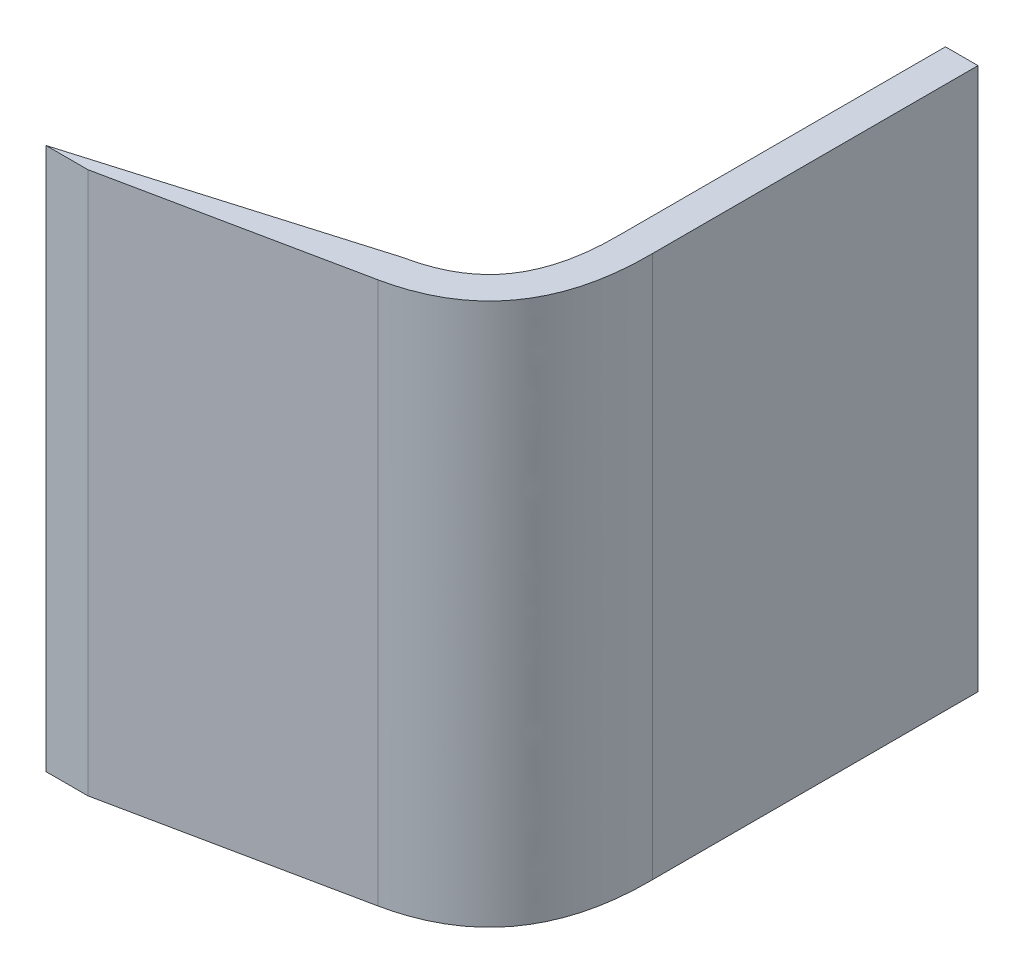
ISO-10303-21;
HEADER;
FILE_DESCRIPTION(('STEP AP214'),'2;1');
FILE_NAME('part.step','',(''),(''),'','','');
FILE_SCHEMA(('AUTOMOTIVE_DESIGN { 1 0 10303 214 1 1 1 1 }'));
ENDSEC;
DATA;
#1=APPLICATION_CONTEXT('core data for automotive mechanical design processes');
#2=APPLICATION_PROTOCOL_DEFINITION('international standard','automotive_design',2000,#1);
#3=PRODUCT_CONTEXT('',#1,'mechanical');
#4=PRODUCT('Part','Part','',(#3));
#5=PRODUCT_RELATED_PRODUCT_CATEGORY('part','',(#4));
#6=PRODUCT_DEFINITION_FORMATION('','',#4);
#7=PRODUCT_DEFINITION_CONTEXT('part definition',#1,'design');
#8=PRODUCT_DEFINITION('design','',#6,#7);
#9=PRODUCT_DEFINITION_SHAPE('','',#8);
#10=(LENGTH_UNIT() NAMED_UNIT(*) SI_UNIT(.MILLI.,.METRE.));
#11=(NAMED_UNIT(*) PLANE_ANGLE_UNIT() SI_UNIT($,.RADIAN.));
#12=(NAMED_UNIT(*) SI_UNIT($,.STERADIAN.) SOLID_ANGLE_UNIT());
#13=UNCERTAINTY_MEASURE_WITH_UNIT(LENGTH_MEASURE(1.E-05),#10,'distance_accuracy_value','');
#14=(GEOMETRIC_REPRESENTATION_CONTEXT(3) GLOBAL_UNCERTAINTY_ASSIGNED_CONTEXT((#13)) GLOBAL_UNIT_ASSIGNED_CONTEXT((#10,
#11,#12)) REPRESENTATION_CONTEXT('',''));
#15=CARTESIAN_POINT('',(0.,0.,0.));
#16=DIRECTION('',(0.,0.,1.));
#17=DIRECTION('',(1.,0.,0.));
#18=AXIS2_PLACEMENT_3D('',#15,#16,#17);
#19=CARTESIAN_POINT('',(0.,50.,0.));
#20=DIRECTION('',(1.,0.,0.));
#21=DIRECTION('',(0.,0.,-1.));
#22=AXIS2_PLACEMENT_3D('',#19,#20,#21);
#23=PLANE('',#22);
#24=DIRECTION('',(0.,0.,1.));
#25=VECTOR('',#24,1.);
#26=CARTESIAN_POINT('',(0.,0.,0.));
#27=LINE('',#26,#25);
#28=CARTESIAN_POINT('',(0.,0.,-30.));
#29=VERTEX_POINT('',#28);
#30=CARTESIAN_POINT('',(0.,0.,0.));
#31=VERTEX_POINT('',#30);
#32=EDGE_CURVE('E208',#29,#31,#27,.T.);
#33=ORIENTED_EDGE('',*,*,#32,.T.);
#34=DIRECTION('',(0.,-1.,0.));
#35=VECTOR('',#34,1.);
#36=CARTESIAN_POINT('',(0.,50.,0.));
#37=LINE('',#36,#35);
#38=CARTESIAN_POINT('',(0.,50.,0.));
#39=VERTEX_POINT('',#38);
#40=EDGE_CURVE('E11',#39,#31,#37,.T.);
#41=ORIENTED_EDGE('',*,*,#40,.F.);
#42=DIRECTION('',(0.,0.,1.));
#43=VECTOR('',#42,1.);
#44=CARTESIAN_POINT('',(0.,50.,0.));
#45=LINE('',#44,#43);
#46=CARTESIAN_POINT('',(0.,50.,-30.));
#47=VERTEX_POINT('',#46);
#48=EDGE_CURVE('E227',#47,#39,#45,.T.);
#49=ORIENTED_EDGE('',*,*,#48,.F.);
#50=DIRECTION('',(0.,-1.,0.));
#51=VECTOR('',#50,1.);
#52=CARTESIAN_POINT('',(0.,50.,-30.));
#53=LINE('',#52,#51);
#54=EDGE_CURVE('E228',#47,#29,#53,.T.);
#55=ORIENTED_EDGE('',*,*,#54,.T.);
#56=EDGE_LOOP('',(#33,#41,#49,#55));
#57=FACE_BOUND('',#56,.T.);
#58=ADVANCED_FACE('F35',(#57),#23,.F.);
#59=CARTESIAN_POINT('',(0.,50.,0.));
#60=DIRECTION('',(0.999984471830344,0.,-0.00557279985177652));
#61=DIRECTION('',(-0.00557279985177652,0.,-0.999984471830344));
#62=AXIS2_PLACEMENT_3D('',#59,#60,#61);
#63=PLANE('',#62);
#64=DIRECTION('',(0.00557279985177651,0.,0.999984471830344));
#65=VECTOR('',#64,1.);
#66=CARTESIAN_POINT('',(0.,0.,0.));
#67=LINE('',#66,#65);
#68=CARTESIAN_POINT('',(0.000186336589124304,0.,0.0334362798977492));
#69=VERTEX_POINT('',#68);
#70=EDGE_CURVE('E204',#31,#69,#67,.T.);
#71=ORIENTED_EDGE('',*,*,#70,.T.);
#72=DIRECTION('',(0.,-1.,0.));
#73=VECTOR('',#72,1.);
#74=CARTESIAN_POINT('',(0.000186336589124304,50.,0.0334362798977492));
#75=LINE('',#74,#73);
#76=CARTESIAN_POINT('',(0.000186336589124304,50.,0.0334362798977492));
#77=VERTEX_POINT('',#76);
#78=EDGE_CURVE('E43',#77,#69,#75,.T.);
#79=ORIENTED_EDGE('',*,*,#78,.F.);
#80=DIRECTION('',(0.00557279985177651,0.,0.999984471830344));
#81=VECTOR('',#80,1.);
#82=CARTESIAN_POINT('',(0.,50.,0.));
#83=LINE('',#82,#81);
#84=EDGE_CURVE('E96',#39,#77,#83,.T.);
#85=ORIENTED_EDGE('',*,*,#84,.F.);
#86=ORIENTED_EDGE('',*,*,#40,.T.);
#87=EDGE_LOOP('',(#71,#79,#85,#86));
#88=FACE_BOUND('',#87,.T.);
#89=ADVANCED_FACE('F162',(#88),#63,.F.);
#90=CARTESIAN_POINT('',(0.000186336589124304,50.,0.0334362798977492));
#91=CARTESIAN_POINT('',(0.00523992869162467,50.,0.48683105601357));
#92=CARTESIAN_POINT('',(-0.00947576806402649,50.,1.41733506240197));
#93=CARTESIAN_POINT('',(-0.13735114650664,50.,3.08788420423487));
#94=CARTESIAN_POINT('',(-0.471550563927061,50.,4.94781119910855));
#95=CARTESIAN_POINT('',(-1.1167972156735,50.,6.78220466929156));
#96=CARTESIAN_POINT('',(-1.97372550815826,50.,8.26954947683295));
#97=CARTESIAN_POINT('',(-3.04288867451293,50.,9.47725171492289));
#98=CARTESIAN_POINT('',(-4.37173121970221,50.,10.4720287681669));
#99=CARTESIAN_POINT('',(-5.76483324125028,50.,11.1430242664896));
#100=CARTESIAN_POINT('',(-7.0595255105966,50.,11.570636996816));
#101=CARTESIAN_POINT('',(-7.79884839732541,50.,11.7511814251003));
#102=CARTESIAN_POINT('',(-8.16140533978625,50.,11.8261369580235));
#103=B_SPLINE_CURVE_WITH_KNOTS('',3,(#90,#91,#92,#93,#94,#95,#96,#97,#98,#99,#100,#101,#102),
.UNSPECIFIED.,.F.,.F.,(4,1,1,1,1,1,1,1,1,1,4),(0.,0.0625,0.125,0.25,0.375,0.5,0.625,0.75,0.875,
0.9375,1.),.UNSPECIFIED.);
#104=DIRECTION('',(0.,-1.,0.));
#105=VECTOR('',#104,1.);
#106=SURFACE_OF_LINEAR_EXTRUSION('',#103,#105);
#107=CARTESIAN_POINT('',(0.000186336589124304,0.,0.0334362798977492));
#108=CARTESIAN_POINT('',(0.00523992869162467,0.,0.48683105601357));
#109=CARTESIAN_POINT('',(-0.00947576806402649,0.,1.41733506240197));
#110=CARTESIAN_POINT('',(-0.13735114650664,0.,3.08788420423487));
#111=CARTESIAN_POINT('',(-0.471550563927061,0.,4.94781119910855));
#112=CARTESIAN_POINT('',(-1.1167972156735,0.,6.78220466929156));
#113=CARTESIAN_POINT('',(-1.97372550815826,0.,8.26954947683295));
#114=CARTESIAN_POINT('',(-3.04288867451293,0.,9.47725171492289));
#115=CARTESIAN_POINT('',(-4.37173121970221,0.,10.4720287681669));
#116=CARTESIAN_POINT('',(-5.76483324125028,0.,11.1430242664896));
#117=CARTESIAN_POINT('',(-7.0595255105966,0.,11.570636996816));
#118=CARTESIAN_POINT('',(-7.79884839732541,0.,11.7511814251003));
#119=CARTESIAN_POINT('',(-8.16140533978625,0.,11.8261369580235));
#120=B_SPLINE_CURVE_WITH_KNOTS('',3,(#107,#108,#109,#110,#111,#112,#113,#114,#115,#116,#117,
#118,#119),.UNSPECIFIED.,.F.,.F.,(4,1,1,1,1,1,1,1,1,1,4),(0.,0.0625,0.125,0.25,0.375,0.5,0.625,
0.75,0.875,0.9375,1.),.UNSPECIFIED.);
#121=CARTESIAN_POINT('',(-8.16140533978625,0.,11.8261369580235));
#122=VERTEX_POINT('',#121);
#123=EDGE_CURVE('E199',#69,#122,#120,.T.);
#124=ORIENTED_EDGE('',*,*,#123,.T.);
#125=DIRECTION('',(0.,-1.,0.));
#126=VECTOR('',#125,1.);
#127=CARTESIAN_POINT('',(-8.16140533978625,50.,11.8261369580235));
#128=LINE('',#127,#126);
#129=CARTESIAN_POINT('',(-8.16140533978625,50.,11.8261369580235));
#130=VERTEX_POINT('',#129);
#131=EDGE_CURVE('E193',#130,#122,#128,.T.);
#132=ORIENTED_EDGE('',*,*,#131,.F.);
#133=EDGE_CURVE('E164',#77,#130,#103,.T.);
#134=ORIENTED_EDGE('',*,*,#133,.F.);
#135=ORIENTED_EDGE('',*,*,#78,.T.);
#136=EDGE_LOOP('',(#124,#132,#134,#135));
#137=FACE_BOUND('',#136,.T.);
#138=ADVANCED_FACE('F158',(#137),#106,.F.);
#139=CARTESIAN_POINT('',(2.55892323496967,50.,8.65749573456613));
#140=DIRECTION('',(0.283450742754242,0.,0.958986796797572));
#141=DIRECTION('',(0.958986796797573,0.,-0.283450742754242));
#142=AXIS2_PLACEMENT_3D('',#139,#140,#141);
#143=PLANE('',#142);
#144=DIRECTION('',(-0.958986796797573,0.,0.283450742754242));
#145=VECTOR('',#144,1.);
#146=CARTESIAN_POINT('',(2.55892323496967,0.,8.65749573456613));
#147=LINE('',#146,#145);
#148=CARTESIAN_POINT('',(-33.5867909433907,0.,19.3411981228081));
#149=VERTEX_POINT('',#148);
#150=EDGE_CURVE('E205',#122,#149,#147,.T.);
#151=ORIENTED_EDGE('',*,*,#150,.T.);
#152=DIRECTION('',(0.,-1.,0.));
#153=VECTOR('',#152,1.);
#154=CARTESIAN_POINT('',(-33.5867909433907,50.,19.3411981228081));
#155=LINE('',#154,#153);
#156=CARTESIAN_POINT('',(-33.5867909433907,50.,19.3411981228081));
#157=VERTEX_POINT('',#156);
#158=EDGE_CURVE('E186',#157,#149,#155,.T.);
#159=ORIENTED_EDGE('',*,*,#158,.F.);
#160=DIRECTION('',(-0.958986796797573,0.,0.283450742754242));
#161=VECTOR('',#160,1.);
#162=CARTESIAN_POINT('',(2.55892323496967,50.,8.65749573456613));
#163=LINE('',#162,#161);
#164=EDGE_CURVE('E170',#130,#157,#163,.T.);
#165=ORIENTED_EDGE('',*,*,#164,.F.);
#166=ORIENTED_EDGE('',*,*,#131,.T.);
#167=EDGE_LOOP('',(#151,#159,#165,#166));
#168=FACE_BOUND('',#167,.T.);
#169=ADVANCED_FACE('F154',(#168),#143,.F.);
#170=CARTESIAN_POINT('',(0.,50.,19.3411981228081));
#171=DIRECTION('',(0.,0.,-1.));
#172=DIRECTION('',(-1.,0.,0.));
#173=AXIS2_PLACEMENT_3D('',#170,#171,#172);
#174=PLANE('',#173);
#175=DIRECTION('',(1.,0.,0.));
#176=VECTOR('',#175,1.);
#177=CARTESIAN_POINT('',(0.,0.,19.3411981228081));
#178=LINE('',#177,#176);
#179=CARTESIAN_POINT('',(-29.7247872958744,0.,19.3411981228081));
#180=VERTEX_POINT('',#179);
#181=EDGE_CURVE('E183',#149,#180,#178,.T.);
#182=ORIENTED_EDGE('',*,*,#181,.T.);
#183=DIRECTION('',(0.,-1.,0.));
#184=VECTOR('',#183,1.);
#185=CARTESIAN_POINT('',(-29.7247872958744,50.,19.3411981228081));
#186=LINE('',#185,#184);
#187=CARTESIAN_POINT('',(-29.7247872958744,50.,19.3411981228081));
#188=VERTEX_POINT('',#187);
#189=EDGE_CURVE('E181',#188,#180,#186,.T.);
#190=ORIENTED_EDGE('',*,*,#189,.F.);
#191=DIRECTION('',(1.,0.,0.));
#192=VECTOR('',#191,1.);
#193=CARTESIAN_POINT('',(0.,50.,19.3411981228081));
#194=LINE('',#193,#192);
#195=EDGE_CURVE('E132',#157,#188,#194,.T.);
#196=ORIENTED_EDGE('',*,*,#195,.F.);
#197=ORIENTED_EDGE('',*,*,#158,.T.);
#198=EDGE_LOOP('',(#182,#190,#196,#197));
#199=FACE_BOUND('',#198,.T.);
#200=ADVANCED_FACE('F150',(#199),#174,.F.);
#201=CARTESIAN_POINT('',(2.6146417221507,50.,12.6646708416674));
#202=DIRECTION('',(-0.202187723277477,0.,-0.979346784625278));
#203=DIRECTION('',(-0.979346784625278,0.,0.202187723277477));
#204=AXIS2_PLACEMENT_3D('',#201,#202,#203);
#205=PLANE('',#204);
#206=DIRECTION('',(0.979346784625278,0.,-0.202187723277477));
#207=VECTOR('',#206,1.);
#208=CARTESIAN_POINT('',(2.6146417221507,0.,12.6646708416674));
#209=LINE('',#208,#207);
#210=CARTESIAN_POINT('',(-7.55402561568838,0.,14.7640086146407));
#211=VERTEX_POINT('',#210);
#212=EDGE_CURVE('E188',#180,#211,#209,.T.);
#213=ORIENTED_EDGE('',*,*,#212,.T.);
#214=DIRECTION('',(0.,-1.,0.));
#215=VECTOR('',#214,1.);
#216=CARTESIAN_POINT('',(-7.55402561568838,50.,14.7640086146407));
#217=LINE('',#216,#215);
#218=CARTESIAN_POINT('',(-7.55402561568838,50.,14.7640086146407));
#219=VERTEX_POINT('',#218);
#220=EDGE_CURVE('E121',#219,#211,#217,.T.);
#221=ORIENTED_EDGE('',*,*,#220,.F.);
#222=DIRECTION('',(0.979346784625278,0.,-0.202187723277477));
#223=VECTOR('',#222,1.);
#224=CARTESIAN_POINT('',(2.6146417221507,50.,12.6646708416674));
#225=LINE('',#224,#223);
#226=EDGE_CURVE('E129',#188,#219,#225,.T.);
#227=ORIENTED_EDGE('',*,*,#226,.F.);
#228=ORIENTED_EDGE('',*,*,#189,.T.);
#229=EDGE_LOOP('',(#213,#221,#227,#228));
#230=FACE_BOUND('',#229,.T.);
#231=ADVANCED_FACE('F146',(#230),#205,.F.);
#232=CARTESIAN_POINT('',(3.,50.,0.));
#233=CARTESIAN_POINT('',(3.13991865238167,50.,12.553127514907));
#234=CARTESIAN_POINT('',(-7.55402561568838,50.,14.7640086146407));
#235=B_SPLINE_CURVE_WITH_KNOTS('',2,(#232,#233,#234),.UNSPECIFIED.,.F.,.F.,(3,3),(0.,1.),.UNSPECIFIED.);
#236=DIRECTION('',(0.,-1.,0.));
#237=VECTOR('',#236,1.);
#238=SURFACE_OF_LINEAR_EXTRUSION('',#235,#237);
#239=CARTESIAN_POINT('',(3.,0.,0.));
#240=CARTESIAN_POINT('',(3.13991865238167,0.,12.553127514907));
#241=CARTESIAN_POINT('',(-7.55402561568838,0.,14.7640086146407));
#242=B_SPLINE_CURVE_WITH_KNOTS('',2,(#239,#240,#241),.UNSPECIFIED.,.F.,.F.,(3,3),(0.,1.),.UNSPECIFIED.);
#243=CARTESIAN_POINT('',(3.,0.,0.));
#244=VERTEX_POINT('',#243);
#245=EDGE_CURVE('E120',#244,#211,#242,.T.);
#246=ORIENTED_EDGE('',*,*,#245,.F.);
#247=DIRECTION('',(0.,-1.,0.));
#248=VECTOR('',#247,1.);
#249=CARTESIAN_POINT('',(3.,50.,0.));
#250=LINE('',#249,#248);
#251=CARTESIAN_POINT('',(3.,50.,0.));
#252=VERTEX_POINT('',#251);
#253=EDGE_CURVE('E114',#252,#244,#250,.T.);
#254=ORIENTED_EDGE('',*,*,#253,.F.);
#255=EDGE_CURVE('E118',#252,#219,#235,.T.);
#256=ORIENTED_EDGE('',*,*,#255,.T.);
#257=ORIENTED_EDGE('',*,*,#220,.T.);
#258=EDGE_LOOP('',(#246,#254,#256,#257));
#259=FACE_BOUND('',#258,.T.);
#260=ADVANCED_FACE('F116',(#259),#238,.T.);
#261=CARTESIAN_POINT('',(3.,50.,0.));
#262=DIRECTION('',(-1.,0.,0.));
#263=DIRECTION('',(0.,0.,1.));
#264=AXIS2_PLACEMENT_3D('',#261,#262,#263);
#265=PLANE('',#264);
#266=DIRECTION('',(0.,0.,-1.));
#267=VECTOR('',#266,1.);
#268=CARTESIAN_POINT('',(3.,0.,0.));
#269=LINE('',#268,#267);
#270=CARTESIAN_POINT('',(3.,0.,-30.));
#271=VERTEX_POINT('',#270);
#272=EDGE_CURVE('E82',#244,#271,#269,.T.);
#273=ORIENTED_EDGE('',*,*,#272,.T.);
#274=DIRECTION('',(0.,-1.,0.));
#275=VECTOR('',#274,1.);
#276=CARTESIAN_POINT('',(3.,50.,-30.));
#277=LINE('',#276,#275);
#278=CARTESIAN_POINT('',(3.,50.,-30.));
#279=VERTEX_POINT('',#278);
#280=EDGE_CURVE('E122',#279,#271,#277,.T.);
#281=ORIENTED_EDGE('',*,*,#280,.F.);
#282=DIRECTION('',(0.,0.,-1.));
#283=VECTOR('',#282,1.);
#284=CARTESIAN_POINT('',(3.,50.,0.));
#285=LINE('',#284,#283);
#286=EDGE_CURVE('E124',#252,#279,#285,.T.);
#287=ORIENTED_EDGE('',*,*,#286,.F.);
#288=ORIENTED_EDGE('',*,*,#253,.T.);
#289=EDGE_LOOP('',(#273,#281,#287,#288));
#290=FACE_BOUND('',#289,.T.);
#291=ADVANCED_FACE('F125',(#290),#265,.F.);
#292=CARTESIAN_POINT('',(0.,50.,-30.));
#293=DIRECTION('',(0.,0.,1.));
#294=DIRECTION('',(1.,0.,0.));
#295=AXIS2_PLACEMENT_3D('',#292,#293,#294);
#296=PLANE('',#295);
#297=DIRECTION('',(-1.,0.,0.));
#298=VECTOR('',#297,1.);
#299=CARTESIAN_POINT('',(0.,0.,-30.));
#300=LINE('',#299,#298);
#301=EDGE_CURVE('E88',#271,#29,#300,.T.);
#302=ORIENTED_EDGE('',*,*,#301,.T.);
#303=ORIENTED_EDGE('',*,*,#54,.F.);
#304=DIRECTION('',(-1.,0.,0.));
#305=VECTOR('',#304,1.);
#306=CARTESIAN_POINT('',(0.,50.,-30.));
#307=LINE('',#306,#305);
#308=EDGE_CURVE('E51',#279,#47,#307,.T.);
#309=ORIENTED_EDGE('',*,*,#308,.F.);
#310=ORIENTED_EDGE('',*,*,#280,.T.);
#311=EDGE_LOOP('',(#302,#303,#309,#310));
#312=FACE_BOUND('',#311,.T.);
#313=ADVANCED_FACE('F229',(#312),#296,.F.);
#314=CARTESIAN_POINT('',(0.,50.,0.));
#315=DIRECTION('',(0.,1.,0.));
#316=DIRECTION('',(0.,0.,1.));
#317=AXIS2_PLACEMENT_3D('',#314,#315,#316);
#318=PLANE('',#317);
#319=ORIENTED_EDGE('',*,*,#48,.T.);
#320=ORIENTED_EDGE('',*,*,#84,.T.);
#321=ORIENTED_EDGE('',*,*,#133,.T.);
#322=ORIENTED_EDGE('',*,*,#164,.T.);
#323=ORIENTED_EDGE('',*,*,#195,.T.);
#324=ORIENTED_EDGE('',*,*,#226,.T.);
#325=ORIENTED_EDGE('',*,*,#255,.F.);
#326=ORIENTED_EDGE('',*,*,#286,.T.);
#327=ORIENTED_EDGE('',*,*,#308,.T.);
#328=EDGE_LOOP('',(#319,#320,#321,#322,#323,#324,#325,#326,#327));
#329=FACE_BOUND('',#328,.T.);
#330=ADVANCED_FACE('F127',(#329),#318,.T.);
#331=CARTESIAN_POINT('',(0.,0.,0.));
#332=DIRECTION('',(0.,1.,0.));
#333=DIRECTION('',(0.,0.,1.));
#334=AXIS2_PLACEMENT_3D('',#331,#332,#333);
#335=PLANE('',#334);
#336=ORIENTED_EDGE('',*,*,#32,.F.);
#337=ORIENTED_EDGE('',*,*,#301,.F.);
#338=ORIENTED_EDGE('',*,*,#272,.F.);
#339=ORIENTED_EDGE('',*,*,#245,.T.);
#340=ORIENTED_EDGE('',*,*,#212,.F.);
#341=ORIENTED_EDGE('',*,*,#181,.F.);
#342=ORIENTED_EDGE('',*,*,#150,.F.);
#343=ORIENTED_EDGE('',*,*,#123,.F.);
#344=ORIENTED_EDGE('',*,*,#70,.F.);
#345=EDGE_LOOP('',(#336,#337,#338,#339,#340,#341,#342,#343,#344));
#346=FACE_BOUND('',#345,.T.);
#347=ADVANCED_FACE('F203',(#346),#335,.F.);
#348=CLOSED_SHELL('',(#58,#89,#138,#169,#200,#231,#260,#291,#313,#330,#347));
#349=MANIFOLD_SOLID_BREP('B2',#348);
#350=ADVANCED_BREP_SHAPE_REPRESENTATION('',(#18,#349),#14);
#351=SHAPE_DEFINITION_REPRESENTATION(#9,#350);
ENDSEC;
END-ISO-10303-21;
